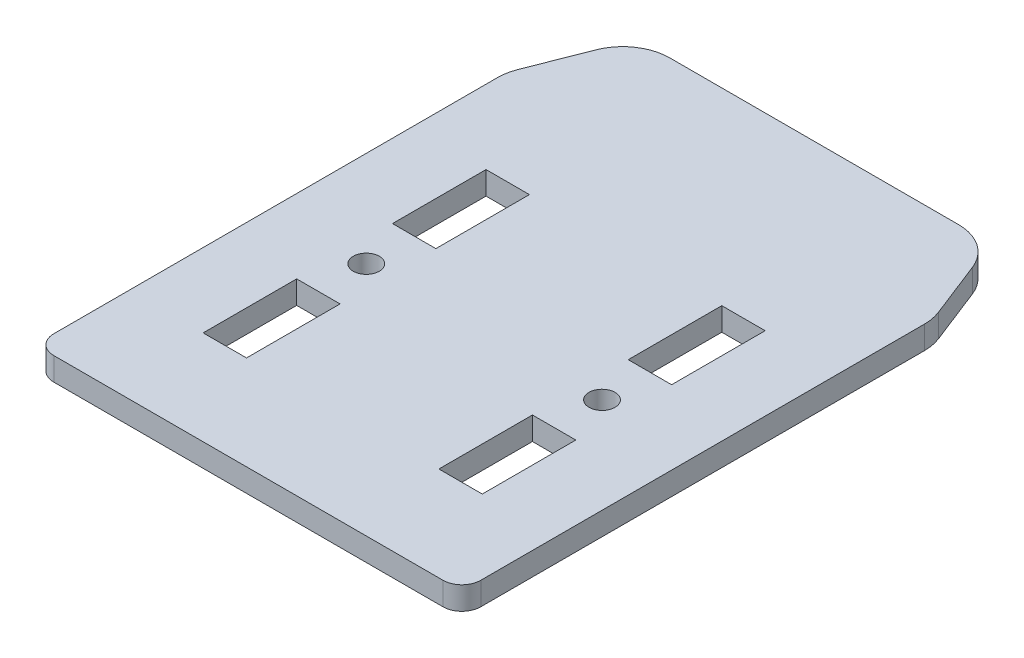
ISO-10303-21;
HEADER;
FILE_DESCRIPTION(('STEP AP214'),'2;1');
FILE_NAME('part.step','',(''),(''),'','','');
FILE_SCHEMA(('AUTOMOTIVE_DESIGN { 1 0 10303 214 1 1 1 1 }'));
ENDSEC;
DATA;
#1=APPLICATION_CONTEXT('core data for automotive mechanical design processes');
#2=APPLICATION_PROTOCOL_DEFINITION('international standard','automotive_design',2000,#1);
#3=PRODUCT_CONTEXT('',#1,'mechanical');
#4=PRODUCT('Part','Part','',(#3));
#5=PRODUCT_RELATED_PRODUCT_CATEGORY('part','',(#4));
#6=PRODUCT_DEFINITION_FORMATION('','',#4);
#7=PRODUCT_DEFINITION_CONTEXT('part definition',#1,'design');
#8=PRODUCT_DEFINITION('design','',#6,#7);
#9=PRODUCT_DEFINITION_SHAPE('','',#8);
#10=(LENGTH_UNIT() NAMED_UNIT(*) SI_UNIT(.MILLI.,.METRE.));
#11=(NAMED_UNIT(*) PLANE_ANGLE_UNIT() SI_UNIT($,.RADIAN.));
#12=(NAMED_UNIT(*) SI_UNIT($,.STERADIAN.) SOLID_ANGLE_UNIT());
#13=UNCERTAINTY_MEASURE_WITH_UNIT(LENGTH_MEASURE(1.E-05),#10,'distance_accuracy_value','');
#14=(GEOMETRIC_REPRESENTATION_CONTEXT(3) GLOBAL_UNCERTAINTY_ASSIGNED_CONTEXT((#13)) GLOBAL_UNIT_ASSIGNED_CONTEXT((#10,
#11,#12)) REPRESENTATION_CONTEXT('',''));
#15=CARTESIAN_POINT('',(0.,0.,0.));
#16=DIRECTION('',(0.,0.,1.));
#17=DIRECTION('',(1.,0.,0.));
#18=AXIS2_PLACEMENT_3D('',#15,#16,#17);
#19=CARTESIAN_POINT('',(28.7528,3.0988,0.));
#20=DIRECTION('',(1.,0.,0.));
#21=DIRECTION('',(0.,0.,-1.));
#22=AXIS2_PLACEMENT_3D('',#19,#20,#21);
#23=PLANE('',#22);
#24=DIRECTION('',(0.,0.,1.));
#25=VECTOR('',#24,1.);
#26=CARTESIAN_POINT('',(28.7528,3.0988,0.));
#27=LINE('',#26,#25);
#28=CARTESIAN_POINT('',(28.7528,3.0988,-24.1998577801837));
#29=VERTEX_POINT('',#28);
#30=CARTESIAN_POINT('',(28.7528,3.0988,35.56));
#31=VERTEX_POINT('',#30);
#32=EDGE_CURVE('E267',#29,#31,#27,.T.);
#33=ORIENTED_EDGE('',*,*,#32,.T.);
#34=DIRECTION('',(0.,1.,0.));
#35=VECTOR('',#34,1.);
#36=CARTESIAN_POINT('',(28.7528,0.,35.56));
#37=LINE('',#36,#35);
#38=CARTESIAN_POINT('',(28.7528,0.,35.56));
#39=VERTEX_POINT('',#38);
#40=EDGE_CURVE('E408',#31,#39,#37,.F.);
#41=ORIENTED_EDGE('',*,*,#40,.T.);
#42=DIRECTION('',(0.,0.,1.));
#43=VECTOR('',#42,1.);
#44=CARTESIAN_POINT('',(28.7528,0.,0.));
#45=LINE('',#44,#43);
#46=CARTESIAN_POINT('',(28.7528,0.,-24.1998577801837));
#47=VERTEX_POINT('',#46);
#48=EDGE_CURVE('E313',#47,#39,#45,.T.);
#49=ORIENTED_EDGE('',*,*,#48,.F.);
#50=DIRECTION('',(0.,1.,0.));
#51=VECTOR('',#50,1.);
#52=CARTESIAN_POINT('',(28.7528,3.0988,-24.1998577801837));
#53=LINE('',#52,#51);
#54=EDGE_CURVE('E389',#47,#29,#53,.T.);
#55=ORIENTED_EDGE('',*,*,#54,.T.);
#56=EDGE_LOOP('',(#33,#41,#49,#55));
#57=FACE_BOUND('',#56,.T.);
#58=ADVANCED_FACE('F37',(#57),#23,.T.);
#59=CARTESIAN_POINT('',(0.,3.0988,0.));
#60=DIRECTION('',(0.,1.,0.));
#61=DIRECTION('',(0.,0.,1.));
#62=AXIS2_PLACEMENT_3D('',#59,#60,#61);
#63=PLANE('',#62);
#64=DIRECTION('',(-0.364960948531727,0.,-0.931022827887062));
#65=VECTOR('',#64,1.);
#66=CARTESIAN_POINT('',(33.55361699767,3.0988,-13.1530178630866));
#67=LINE('',#66,#65);
#68=CARTESIAN_POINT('',(28.3147949570828,3.0988,-26.5173598033601));
#69=VERTEX_POINT('',#68);
#70=CARTESIAN_POINT('',(25.3551392069149,3.0988,-34.0675020231763));
#71=VERTEX_POINT('',#70);
#72=EDGE_CURVE('E424',#69,#71,#67,.T.);
#73=ORIENTED_EDGE('',*,*,#72,.T.);
#74=CARTESIAN_POINT('',(19.4431442498321,3.0988,-31.7499999999998));
#75=DIRECTION('',(0.,1.,0.));
#76=DIRECTION('',(0.,0.,1.));
#77=AXIS2_PLACEMENT_3D('',#74,#75,#76);
#78=CIRCLE('',#77,6.35);
#79=CARTESIAN_POINT('',(19.4431442498321,3.0988,-38.0999999999998));
#80=VERTEX_POINT('',#79);
#81=EDGE_CURVE('E45',#71,#80,#78,.T.);
#82=ORIENTED_EDGE('',*,*,#81,.T.);
#83=DIRECTION('',(-1.,0.,0.));
#84=VECTOR('',#83,1.);
#85=CARTESIAN_POINT('',(35.2771787575676,3.0988,-38.0999999999998));
#86=LINE('',#85,#84);
#87=CARTESIAN_POINT('',(-19.4431442498321,3.0988,-38.0999999999998));
#88=VERTEX_POINT('',#87);
#89=EDGE_CURVE('E423',#80,#88,#86,.T.);
#90=ORIENTED_EDGE('',*,*,#89,.T.);
#91=CARTESIAN_POINT('',(-19.4431442498321,3.0988,-31.7499999999998));
#92=DIRECTION('',(0.,1.,0.));
#93=DIRECTION('',(0.,0.,1.));
#94=AXIS2_PLACEMENT_3D('',#91,#92,#93);
#95=CIRCLE('',#94,6.35);
#96=CARTESIAN_POINT('',(-25.3551392069149,3.0988,-34.0675020231763));
#97=VERTEX_POINT('',#96);
#98=EDGE_CURVE('E52',#88,#97,#95,.T.);
#99=ORIENTED_EDGE('',*,*,#98,.T.);
#100=DIRECTION('',(0.364960948531727,0.,-0.931022827887062));
#101=VECTOR('',#100,1.);
#102=CARTESIAN_POINT('',(-33.55361699767,3.0988,-13.1530178630866));
#103=LINE('',#102,#101);
#104=CARTESIAN_POINT('',(-28.3147949570828,3.0988,-26.5173598033601));
#105=VERTEX_POINT('',#104);
#106=EDGE_CURVE('E451',#105,#97,#103,.T.);
#107=ORIENTED_EDGE('',*,*,#106,.F.);
#108=CARTESIAN_POINT('',(-22.4028,3.0988,-24.1998577801836));
#109=DIRECTION('',(0.,1.,0.));
#110=DIRECTION('',(0.,0.,1.));
#111=AXIS2_PLACEMENT_3D('',#108,#109,#110);
#112=CIRCLE('',#111,6.35);
#113=CARTESIAN_POINT('',(-28.7528,3.0988,-24.1998577801836));
#114=VERTEX_POINT('',#113);
#115=EDGE_CURVE('E376',#105,#114,#112,.T.);
#116=ORIENTED_EDGE('',*,*,#115,.T.);
#117=DIRECTION('',(0.,0.,1.));
#118=VECTOR('',#117,1.);
#119=CARTESIAN_POINT('',(-28.7528,3.0988,0.));
#120=LINE('',#119,#118);
#121=CARTESIAN_POINT('',(-28.7528,3.0988,35.56));
#122=VERTEX_POINT('',#121);
#123=EDGE_CURVE('E270',#114,#122,#120,.T.);
#124=ORIENTED_EDGE('',*,*,#123,.T.);
#125=CARTESIAN_POINT('',(-26.2128,3.0988,35.56));
#126=DIRECTION('',(0.,1.,0.));
#127=DIRECTION('',(0.,0.,1.));
#128=AXIS2_PLACEMENT_3D('',#125,#126,#127);
#129=CIRCLE('',#128,2.54);
#130=CARTESIAN_POINT('',(-26.2128,3.0988,38.1));
#131=VERTEX_POINT('',#130);
#132=EDGE_CURVE('E406',#122,#131,#129,.T.);
#133=ORIENTED_EDGE('',*,*,#132,.T.);
#134=DIRECTION('',(1.,0.,0.));
#135=VECTOR('',#134,1.);
#136=CARTESIAN_POINT('',(28.7528,3.0988,38.1));
#137=LINE('',#136,#135);
#138=CARTESIAN_POINT('',(26.2128,3.0988,38.1));
#139=VERTEX_POINT('',#138);
#140=EDGE_CURVE('E818',#131,#139,#137,.T.);
#141=ORIENTED_EDGE('',*,*,#140,.T.);
#142=CARTESIAN_POINT('',(26.2128,3.0988,35.56));
#143=DIRECTION('',(0.,1.,0.));
#144=DIRECTION('',(0.,0.,1.));
#145=AXIS2_PLACEMENT_3D('',#142,#143,#144);
#146=CIRCLE('',#145,2.54);
#147=EDGE_CURVE('E404',#139,#31,#146,.T.);
#148=ORIENTED_EDGE('',*,*,#147,.T.);
#149=ORIENTED_EDGE('',*,*,#32,.F.);
#150=CARTESIAN_POINT('',(22.4028,3.0988,-24.1998577801837));
#151=DIRECTION('',(0.,1.,0.));
#152=DIRECTION('',(0.,0.,1.));
#153=AXIS2_PLACEMENT_3D('',#150,#151,#152);
#154=CIRCLE('',#153,6.35);
#155=EDGE_CURVE('E352',#29,#69,#154,.T.);
#156=ORIENTED_EDGE('',*,*,#155,.T.);
#157=EDGE_LOOP('',(#73,#82,#90,#99,#107,#116,#124,#133,#141,#148,#149,#156));
#158=FACE_BOUND('',#157,.T.);
#159=CARTESIAN_POINT('',(15.875,3.0988,6.35000000000003));
#160=DIRECTION('',(0.,1.,0.));
#161=DIRECTION('',(0.,0.,1.));
#162=AXIS2_PLACEMENT_3D('',#159,#160,#161);
#163=CIRCLE('',#162,1.7526);
#164=CARTESIAN_POINT('',(15.875,3.0988,8.10260000000003));
#165=VERTEX_POINT('',#164);
#166=EDGE_CURVE('E443',#165,#165,#163,.T.);
#167=ORIENTED_EDGE('',*,*,#166,.F.);
#168=EDGE_LOOP('',(#167));
#169=FACE_BOUND('',#168,.T.);
#170=CARTESIAN_POINT('',(-15.875,3.0988,6.35000000000004));
#171=DIRECTION('',(0.,1.,0.));
#172=DIRECTION('',(0.,0.,1.));
#173=AXIS2_PLACEMENT_3D('',#170,#171,#172);
#174=CIRCLE('',#173,1.7526);
#175=CARTESIAN_POINT('',(-15.875,3.0988,8.10260000000004));
#176=VERTEX_POINT('',#175);
#177=EDGE_CURVE('E455',#176,#176,#174,.T.);
#178=ORIENTED_EDGE('',*,*,#177,.F.);
#179=EDGE_LOOP('',(#178));
#180=FACE_BOUND('',#179,.T.);
#181=DIRECTION('',(0.,0.,-1.));
#182=VECTOR('',#181,1.);
#183=CARTESIAN_POINT('',(-12.954,3.0988,0.));
#184=LINE('',#183,#182);
#185=CARTESIAN_POINT('',(-12.954,3.0988,-0.0999999999999708));
#186=VERTEX_POINT('',#185);
#187=CARTESIAN_POINT('',(-12.954,3.0988,-12.7));
#188=VERTEX_POINT('',#187);
#189=EDGE_CURVE('E229',#186,#188,#184,.T.);
#190=ORIENTED_EDGE('',*,*,#189,.F.);
#191=DIRECTION('',(1.,0.,0.));
#192=VECTOR('',#191,1.);
#193=CARTESIAN_POINT('',(0.,3.0988,-0.0999999999999852));
#194=LINE('',#193,#192);
#195=CARTESIAN_POINT('',(-18.796,3.0988,-0.0999999999999643));
#196=VERTEX_POINT('',#195);
#197=EDGE_CURVE('E245',#196,#186,#194,.T.);
#198=ORIENTED_EDGE('',*,*,#197,.F.);
#199=DIRECTION('',(0.,0.,1.));
#200=VECTOR('',#199,1.);
#201=CARTESIAN_POINT('',(-18.796,3.0988,0.));
#202=LINE('',#201,#200);
#203=CARTESIAN_POINT('',(-18.796,3.0988,-12.7));
#204=VERTEX_POINT('',#203);
#205=EDGE_CURVE('E252',#204,#196,#202,.T.);
#206=ORIENTED_EDGE('',*,*,#205,.F.);
#207=DIRECTION('',(-1.,0.,0.));
#208=VECTOR('',#207,1.);
#209=CARTESIAN_POINT('',(0.,3.0988,-12.7));
#210=LINE('',#209,#208);
#211=EDGE_CURVE('E248',#188,#204,#210,.T.);
#212=ORIENTED_EDGE('',*,*,#211,.F.);
#213=EDGE_LOOP('',(#190,#198,#206,#212));
#214=FACE_BOUND('',#213,.T.);
#215=DIRECTION('',(-1.,0.,0.));
#216=VECTOR('',#215,1.);
#217=CARTESIAN_POINT('',(0.,3.0988,-0.0999999999999852));
#218=LINE('',#217,#216);
#219=CARTESIAN_POINT('',(18.796,3.0988,-0.0999999999999643));
#220=VERTEX_POINT('',#219);
#221=CARTESIAN_POINT('',(12.954,3.0988,-0.0999999999999708));
#222=VERTEX_POINT('',#221);
#223=EDGE_CURVE('E258',#220,#222,#218,.T.);
#224=ORIENTED_EDGE('',*,*,#223,.T.);
#225=DIRECTION('',(0.,0.,-1.));
#226=VECTOR('',#225,1.);
#227=CARTESIAN_POINT('',(12.954,3.0988,0.));
#228=LINE('',#227,#226);
#229=CARTESIAN_POINT('',(12.954,3.0988,-12.7));
#230=VERTEX_POINT('',#229);
#231=EDGE_CURVE('E261',#222,#230,#228,.T.);
#232=ORIENTED_EDGE('',*,*,#231,.T.);
#233=DIRECTION('',(1.,0.,0.));
#234=VECTOR('',#233,1.);
#235=CARTESIAN_POINT('',(0.,3.0988,-12.7));
#236=LINE('',#235,#234);
#237=CARTESIAN_POINT('',(18.796,3.0988,-12.7));
#238=VERTEX_POINT('',#237);
#239=EDGE_CURVE('E263',#230,#238,#236,.T.);
#240=ORIENTED_EDGE('',*,*,#239,.T.);
#241=DIRECTION('',(0.,0.,1.));
#242=VECTOR('',#241,1.);
#243=CARTESIAN_POINT('',(18.796,3.0988,0.));
#244=LINE('',#243,#242);
#245=EDGE_CURVE('E265',#238,#220,#244,.T.);
#246=ORIENTED_EDGE('',*,*,#245,.T.);
#247=EDGE_LOOP('',(#224,#232,#240,#246));
#248=FACE_BOUND('',#247,.T.);
#249=DIRECTION('',(1.,0.,0.));
#250=VECTOR('',#249,1.);
#251=CARTESIAN_POINT('',(0.,3.0988,25.4));
#252=LINE('',#251,#250);
#253=CARTESIAN_POINT('',(12.954,3.0988,25.4));
#254=VERTEX_POINT('',#253);
#255=CARTESIAN_POINT('',(18.796,3.0988,25.4));
#256=VERTEX_POINT('',#255);
#257=EDGE_CURVE('E273',#254,#256,#252,.T.);
#258=ORIENTED_EDGE('',*,*,#257,.F.);
#259=DIRECTION('',(0.,0.,-1.));
#260=VECTOR('',#259,1.);
#261=CARTESIAN_POINT('',(12.954,3.0988,0.));
#262=LINE('',#261,#260);
#263=CARTESIAN_POINT('',(12.954,3.0988,12.8));
#264=VERTEX_POINT('',#263);
#265=EDGE_CURVE('E276',#254,#264,#262,.T.);
#266=ORIENTED_EDGE('',*,*,#265,.T.);
#267=DIRECTION('',(-1.,0.,0.));
#268=VECTOR('',#267,1.);
#269=CARTESIAN_POINT('',(0.,3.0988,12.8));
#270=LINE('',#269,#268);
#271=CARTESIAN_POINT('',(18.796,3.0988,12.8));
#272=VERTEX_POINT('',#271);
#273=EDGE_CURVE('E278',#272,#264,#270,.T.);
#274=ORIENTED_EDGE('',*,*,#273,.F.);
#275=DIRECTION('',(0.,0.,1.));
#276=VECTOR('',#275,1.);
#277=CARTESIAN_POINT('',(18.796,3.0988,0.));
#278=LINE('',#277,#276);
#279=EDGE_CURVE('E281',#272,#256,#278,.T.);
#280=ORIENTED_EDGE('',*,*,#279,.T.);
#281=EDGE_LOOP('',(#258,#266,#274,#280));
#282=FACE_BOUND('',#281,.T.);
#283=DIRECTION('',(1.,0.,0.));
#284=VECTOR('',#283,1.);
#285=CARTESIAN_POINT('',(0.,3.0988,12.8));
#286=LINE('',#285,#284);
#287=CARTESIAN_POINT('',(-18.796,3.0988,12.8));
#288=VERTEX_POINT('',#287);
#289=CARTESIAN_POINT('',(-12.954,3.0988,12.8));
#290=VERTEX_POINT('',#289);
#291=EDGE_CURVE('E283',#288,#290,#286,.T.);
#292=ORIENTED_EDGE('',*,*,#291,.T.);
#293=DIRECTION('',(0.,0.,1.));
#294=VECTOR('',#293,1.);
#295=CARTESIAN_POINT('',(-12.954,3.0988,0.));
#296=LINE('',#295,#294);
#297=CARTESIAN_POINT('',(-12.954,3.0988,25.4));
#298=VERTEX_POINT('',#297);
#299=EDGE_CURVE('E286',#290,#298,#296,.T.);
#300=ORIENTED_EDGE('',*,*,#299,.T.);
#301=DIRECTION('',(-1.,0.,0.));
#302=VECTOR('',#301,1.);
#303=CARTESIAN_POINT('',(0.,3.0988,25.4));
#304=LINE('',#303,#302);
#305=CARTESIAN_POINT('',(-18.796,3.0988,25.4));
#306=VERTEX_POINT('',#305);
#307=EDGE_CURVE('E288',#298,#306,#304,.T.);
#308=ORIENTED_EDGE('',*,*,#307,.T.);
#309=DIRECTION('',(0.,0.,1.));
#310=VECTOR('',#309,1.);
#311=CARTESIAN_POINT('',(-18.796,3.0988,0.));
#312=LINE('',#311,#310);
#313=EDGE_CURVE('E290',#288,#306,#312,.T.);
#314=ORIENTED_EDGE('',*,*,#313,.F.);
#315=EDGE_LOOP('',(#292,#300,#308,#314));
#316=FACE_BOUND('',#315,.T.);
#317=ADVANCED_FACE('F242',(#158,#169,#180,#214,#248,#282,#316),#63,.T.);
#318=CARTESIAN_POINT('',(0.,0.,0.));
#319=DIRECTION('',(0.,1.,0.));
#320=DIRECTION('',(0.,0.,1.));
#321=AXIS2_PLACEMENT_3D('',#318,#319,#320);
#322=PLANE('',#321);
#323=CARTESIAN_POINT('',(15.875,0.,6.35000000000003));
#324=DIRECTION('',(0.,1.,0.));
#325=DIRECTION('',(0.,0.,1.));
#326=AXIS2_PLACEMENT_3D('',#323,#324,#325);
#327=CIRCLE('',#326,1.7526);
#328=CARTESIAN_POINT('',(15.875,0.,8.10260000000003));
#329=VERTEX_POINT('',#328);
#330=EDGE_CURVE('E446',#329,#329,#327,.T.);
#331=ORIENTED_EDGE('',*,*,#330,.T.);
#332=EDGE_LOOP('',(#331));
#333=FACE_BOUND('',#332,.T.);
#334=CARTESIAN_POINT('',(-15.875,0.,6.35000000000004));
#335=DIRECTION('',(0.,1.,0.));
#336=DIRECTION('',(0.,0.,1.));
#337=AXIS2_PLACEMENT_3D('',#334,#335,#336);
#338=CIRCLE('',#337,1.7526);
#339=CARTESIAN_POINT('',(-15.875,0.,8.10260000000004));
#340=VERTEX_POINT('',#339);
#341=EDGE_CURVE('E296',#340,#340,#338,.T.);
#342=ORIENTED_EDGE('',*,*,#341,.T.);
#343=EDGE_LOOP('',(#342));
#344=FACE_BOUND('',#343,.T.);
#345=DIRECTION('',(0.,0.,-1.));
#346=VECTOR('',#345,1.);
#347=CARTESIAN_POINT('',(-12.954,0.,0.));
#348=LINE('',#347,#346);
#349=CARTESIAN_POINT('',(-12.954,0.,-0.0999999999999708));
#350=VERTEX_POINT('',#349);
#351=CARTESIAN_POINT('',(-12.954,0.,-12.7));
#352=VERTEX_POINT('',#351);
#353=EDGE_CURVE('E232',#350,#352,#348,.T.);
#354=ORIENTED_EDGE('',*,*,#353,.T.);
#355=DIRECTION('',(-1.,0.,0.));
#356=VECTOR('',#355,1.);
#357=CARTESIAN_POINT('',(0.,0.,-12.7));
#358=LINE('',#357,#356);
#359=CARTESIAN_POINT('',(-18.796,0.,-12.7));
#360=VERTEX_POINT('',#359);
#361=EDGE_CURVE('E301',#352,#360,#358,.T.);
#362=ORIENTED_EDGE('',*,*,#361,.T.);
#363=DIRECTION('',(0.,0.,1.));
#364=VECTOR('',#363,1.);
#365=CARTESIAN_POINT('',(-18.796,0.,0.));
#366=LINE('',#365,#364);
#367=CARTESIAN_POINT('',(-18.796,0.,-0.0999999999999643));
#368=VERTEX_POINT('',#367);
#369=EDGE_CURVE('E298',#360,#368,#366,.T.);
#370=ORIENTED_EDGE('',*,*,#369,.T.);
#371=DIRECTION('',(1.,0.,0.));
#372=VECTOR('',#371,1.);
#373=CARTESIAN_POINT('',(0.,0.,-0.0999999999999852));
#374=LINE('',#373,#372);
#375=EDGE_CURVE('E295',#368,#350,#374,.T.);
#376=ORIENTED_EDGE('',*,*,#375,.T.);
#377=EDGE_LOOP('',(#354,#362,#370,#376));
#378=FACE_BOUND('',#377,.T.);
#379=DIRECTION('',(-1.,0.,0.));
#380=VECTOR('',#379,1.);
#381=CARTESIAN_POINT('',(0.,0.,-0.0999999999999852));
#382=LINE('',#381,#380);
#383=CARTESIAN_POINT('',(18.796,0.,-0.0999999999999643));
#384=VERTEX_POINT('',#383);
#385=CARTESIAN_POINT('',(12.954,0.,-0.0999999999999708));
#386=VERTEX_POINT('',#385);
#387=EDGE_CURVE('E304',#384,#386,#382,.T.);
#388=ORIENTED_EDGE('',*,*,#387,.F.);
#389=DIRECTION('',(0.,0.,1.));
#390=VECTOR('',#389,1.);
#391=CARTESIAN_POINT('',(18.796,0.,0.));
#392=LINE('',#391,#390);
#393=CARTESIAN_POINT('',(18.796,0.,-12.7));
#394=VERTEX_POINT('',#393);
#395=EDGE_CURVE('E311',#394,#384,#392,.T.);
#396=ORIENTED_EDGE('',*,*,#395,.F.);
#397=DIRECTION('',(1.,0.,0.));
#398=VECTOR('',#397,1.);
#399=CARTESIAN_POINT('',(0.,0.,-12.7));
#400=LINE('',#399,#398);
#401=CARTESIAN_POINT('',(12.954,0.,-12.7));
#402=VERTEX_POINT('',#401);
#403=EDGE_CURVE('E309',#402,#394,#400,.T.);
#404=ORIENTED_EDGE('',*,*,#403,.F.);
#405=DIRECTION('',(0.,0.,-1.));
#406=VECTOR('',#405,1.);
#407=CARTESIAN_POINT('',(12.954,0.,0.));
#408=LINE('',#407,#406);
#409=EDGE_CURVE('E307',#386,#402,#408,.T.);
#410=ORIENTED_EDGE('',*,*,#409,.F.);
#411=EDGE_LOOP('',(#388,#396,#404,#410));
#412=FACE_BOUND('',#411,.T.);
#413=DIRECTION('',(1.,0.,0.));
#414=VECTOR('',#413,1.);
#415=CARTESIAN_POINT('',(0.,0.,25.4));
#416=LINE('',#415,#414);
#417=CARTESIAN_POINT('',(12.954,0.,25.4));
#418=VERTEX_POINT('',#417);
#419=CARTESIAN_POINT('',(18.796,0.,25.4));
#420=VERTEX_POINT('',#419);
#421=EDGE_CURVE('E319',#418,#420,#416,.T.);
#422=ORIENTED_EDGE('',*,*,#421,.T.);
#423=DIRECTION('',(0.,0.,1.));
#424=VECTOR('',#423,1.);
#425=CARTESIAN_POINT('',(18.796,0.,0.));
#426=LINE('',#425,#424);
#427=CARTESIAN_POINT('',(18.796,0.,12.8));
#428=VERTEX_POINT('',#427);
#429=EDGE_CURVE('E328',#428,#420,#426,.T.);
#430=ORIENTED_EDGE('',*,*,#429,.F.);
#431=DIRECTION('',(-1.,0.,0.));
#432=VECTOR('',#431,1.);
#433=CARTESIAN_POINT('',(0.,0.,12.8));
#434=LINE('',#433,#432);
#435=CARTESIAN_POINT('',(12.954,0.,12.8));
#436=VERTEX_POINT('',#435);
#437=EDGE_CURVE('E325',#428,#436,#434,.T.);
#438=ORIENTED_EDGE('',*,*,#437,.T.);
#439=DIRECTION('',(0.,0.,-1.));
#440=VECTOR('',#439,1.);
#441=CARTESIAN_POINT('',(12.954,0.,0.));
#442=LINE('',#441,#440);
#443=EDGE_CURVE('E322',#418,#436,#442,.T.);
#444=ORIENTED_EDGE('',*,*,#443,.F.);
#445=EDGE_LOOP('',(#422,#430,#438,#444));
#446=FACE_BOUND('',#445,.T.);
#447=DIRECTION('',(1.,0.,0.));
#448=VECTOR('',#447,1.);
#449=CARTESIAN_POINT('',(0.,0.,12.8));
#450=LINE('',#449,#448);
#451=CARTESIAN_POINT('',(-18.796,0.,12.8));
#452=VERTEX_POINT('',#451);
#453=CARTESIAN_POINT('',(-12.954,0.,12.8));
#454=VERTEX_POINT('',#453);
#455=EDGE_CURVE('E331',#452,#454,#450,.T.);
#456=ORIENTED_EDGE('',*,*,#455,.F.);
#457=DIRECTION('',(0.,0.,1.));
#458=VECTOR('',#457,1.);
#459=CARTESIAN_POINT('',(-18.796,0.,0.));
#460=LINE('',#459,#458);
#461=CARTESIAN_POINT('',(-18.796,0.,25.4));
#462=VERTEX_POINT('',#461);
#463=EDGE_CURVE('E249',#452,#462,#460,.T.);
#464=ORIENTED_EDGE('',*,*,#463,.T.);
#465=DIRECTION('',(-1.,0.,0.));
#466=VECTOR('',#465,1.);
#467=CARTESIAN_POINT('',(0.,0.,25.4));
#468=LINE('',#467,#466);
#469=CARTESIAN_POINT('',(-12.954,0.,25.4));
#470=VERTEX_POINT('',#469);
#471=EDGE_CURVE('E336',#470,#462,#468,.T.);
#472=ORIENTED_EDGE('',*,*,#471,.F.);
#473=DIRECTION('',(0.,0.,1.));
#474=VECTOR('',#473,1.);
#475=CARTESIAN_POINT('',(-12.954,0.,0.));
#476=LINE('',#475,#474);
#477=EDGE_CURVE('E334',#454,#470,#476,.T.);
#478=ORIENTED_EDGE('',*,*,#477,.F.);
#479=EDGE_LOOP('',(#456,#464,#472,#478));
#480=FACE_BOUND('',#479,.T.);
#481=DIRECTION('',(-1.,0.,0.));
#482=VECTOR('',#481,1.);
#483=CARTESIAN_POINT('',(35.2771787575676,0.,-38.0999999999998));
#484=LINE('',#483,#482);
#485=CARTESIAN_POINT('',(19.4431442498321,0.,-38.0999999999998));
#486=VERTEX_POINT('',#485);
#487=CARTESIAN_POINT('',(-19.4431442498321,0.,-38.0999999999998));
#488=VERTEX_POINT('',#487);
#489=EDGE_CURVE('E433',#486,#488,#484,.T.);
#490=ORIENTED_EDGE('',*,*,#489,.F.);
#491=CARTESIAN_POINT('',(19.4431442498321,0.,-31.7499999999998));
#492=DIRECTION('',(0.,1.,0.));
#493=DIRECTION('',(0.,0.,1.));
#494=AXIS2_PLACEMENT_3D('',#491,#492,#493);
#495=CIRCLE('',#494,6.35);
#496=CARTESIAN_POINT('',(25.3551392069149,0.,-34.0675020231763));
#497=VERTEX_POINT('',#496);
#498=EDGE_CURVE('E417',#486,#497,#495,.F.);
#499=ORIENTED_EDGE('',*,*,#498,.T.);
#500=DIRECTION('',(-0.364960948531727,0.,-0.931022827887062));
#501=VECTOR('',#500,1.);
#502=CARTESIAN_POINT('',(33.55361699767,0.,-13.1530178630866));
#503=LINE('',#502,#501);
#504=CARTESIAN_POINT('',(28.3147949570828,0.,-26.5173598033601));
#505=VERTEX_POINT('',#504);
#506=EDGE_CURVE('E439',#505,#497,#503,.T.);
#507=ORIENTED_EDGE('',*,*,#506,.F.);
#508=CARTESIAN_POINT('',(22.4028,0.,-24.1998577801837));
#509=DIRECTION('',(0.,1.,0.));
#510=DIRECTION('',(0.,0.,1.));
#511=AXIS2_PLACEMENT_3D('',#508,#509,#510);
#512=CIRCLE('',#511,6.35);
#513=EDGE_CURVE('E378',#505,#47,#512,.F.);
#514=ORIENTED_EDGE('',*,*,#513,.T.);
#515=ORIENTED_EDGE('',*,*,#48,.T.);
#516=CARTESIAN_POINT('',(26.2128,0.,35.56));
#517=DIRECTION('',(0.,1.,0.));
#518=DIRECTION('',(0.,0.,1.));
#519=AXIS2_PLACEMENT_3D('',#516,#517,#518);
#520=CIRCLE('',#519,2.54);
#521=CARTESIAN_POINT('',(26.2128,0.,38.1));
#522=VERTEX_POINT('',#521);
#523=EDGE_CURVE('E398',#39,#522,#520,.F.);
#524=ORIENTED_EDGE('',*,*,#523,.T.);
#525=DIRECTION('',(1.,0.,0.));
#526=VECTOR('',#525,1.);
#527=CARTESIAN_POINT('',(28.7528,0.,38.1));
#528=LINE('',#527,#526);
#529=CARTESIAN_POINT('',(-26.2128,0.,38.1));
#530=VERTEX_POINT('',#529);
#531=EDGE_CURVE('E432',#530,#522,#528,.T.);
#532=ORIENTED_EDGE('',*,*,#531,.F.);
#533=CARTESIAN_POINT('',(-26.2128,0.,35.56));
#534=DIRECTION('',(0.,1.,0.));
#535=DIRECTION('',(0.,0.,1.));
#536=AXIS2_PLACEMENT_3D('',#533,#534,#535);
#537=CIRCLE('',#536,2.54);
#538=CARTESIAN_POINT('',(-28.7528,0.,35.56));
#539=VERTEX_POINT('',#538);
#540=EDGE_CURVE('E400',#530,#539,#537,.F.);
#541=ORIENTED_EDGE('',*,*,#540,.T.);
#542=DIRECTION('',(0.,0.,1.));
#543=VECTOR('',#542,1.);
#544=CARTESIAN_POINT('',(-28.7528,0.,0.));
#545=LINE('',#544,#543);
#546=CARTESIAN_POINT('',(-28.7528,0.,-24.1998577801836));
#547=VERTEX_POINT('',#546);
#548=EDGE_CURVE('E316',#547,#539,#545,.T.);
#549=ORIENTED_EDGE('',*,*,#548,.F.);
#550=CARTESIAN_POINT('',(-22.4028,0.,-24.1998577801836));
#551=DIRECTION('',(0.,1.,0.));
#552=DIRECTION('',(0.,0.,1.));
#553=AXIS2_PLACEMENT_3D('',#550,#551,#552);
#554=CIRCLE('',#553,6.35);
#555=CARTESIAN_POINT('',(-28.3147949570828,0.,-26.5173598033601));
#556=VERTEX_POINT('',#555);
#557=EDGE_CURVE('E380',#547,#556,#554,.F.);
#558=ORIENTED_EDGE('',*,*,#557,.T.);
#559=DIRECTION('',(0.364960948531727,0.,-0.931022827887062));
#560=VECTOR('',#559,1.);
#561=CARTESIAN_POINT('',(-33.55361699767,0.,-13.1530178630866));
#562=LINE('',#561,#560);
#563=CARTESIAN_POINT('',(-25.3551392069149,0.,-34.0675020231763));
#564=VERTEX_POINT('',#563);
#565=EDGE_CURVE('E448',#556,#564,#562,.T.);
#566=ORIENTED_EDGE('',*,*,#565,.T.);
#567=CARTESIAN_POINT('',(-19.4431442498321,0.,-31.7499999999998));
#568=DIRECTION('',(0.,1.,0.));
#569=DIRECTION('',(0.,0.,1.));
#570=AXIS2_PLACEMENT_3D('',#567,#568,#569);
#571=CIRCLE('',#570,6.35);
#572=EDGE_CURVE('E415',#564,#488,#571,.F.);
#573=ORIENTED_EDGE('',*,*,#572,.T.);
#574=EDGE_LOOP('',(#490,#499,#507,#514,#515,#524,#532,#541,#549,#558,#566,#573));
#575=FACE_BOUND('',#574,.T.);
#576=ADVANCED_FACE('F438',(#333,#344,#378,#412,#446,#480,#575),#322,.F.);
#577=CARTESIAN_POINT('',(0.,3.0988,12.8));
#578=DIRECTION('',(0.,0.,-1.));
#579=DIRECTION('',(-1.,0.,0.));
#580=AXIS2_PLACEMENT_3D('',#577,#578,#579);
#581=PLANE('',#580);
#582=ORIENTED_EDGE('',*,*,#455,.T.);
#583=DIRECTION('',(0.,-1.,0.));
#584=VECTOR('',#583,1.);
#585=CARTESIAN_POINT('',(-12.954,3.0988,12.8));
#586=LINE('',#585,#584);
#587=EDGE_CURVE('E349',#290,#454,#586,.T.);
#588=ORIENTED_EDGE('',*,*,#587,.F.);
#589=ORIENTED_EDGE('',*,*,#291,.F.);
#590=DIRECTION('',(0.,-1.,0.));
#591=VECTOR('',#590,1.);
#592=CARTESIAN_POINT('',(-18.796,3.0988,12.8));
#593=LINE('',#592,#591);
#594=EDGE_CURVE('E341',#288,#452,#593,.T.);
#595=ORIENTED_EDGE('',*,*,#594,.T.);
#596=EDGE_LOOP('',(#582,#588,#589,#595));
#597=FACE_BOUND('',#596,.T.);
#598=ADVANCED_FACE('F468',(#597),#581,.F.);
#599=CARTESIAN_POINT('',(-12.954,3.0988,0.));
#600=DIRECTION('',(1.,0.,0.));
#601=DIRECTION('',(0.,0.,-1.));
#602=AXIS2_PLACEMENT_3D('',#599,#600,#601);
#603=PLANE('',#602);
#604=ORIENTED_EDGE('',*,*,#477,.T.);
#605=DIRECTION('',(0.,-1.,0.));
#606=VECTOR('',#605,1.);
#607=CARTESIAN_POINT('',(-12.954,3.0988,25.4));
#608=LINE('',#607,#606);
#609=EDGE_CURVE('E346',#298,#470,#608,.T.);
#610=ORIENTED_EDGE('',*,*,#609,.F.);
#611=ORIENTED_EDGE('',*,*,#299,.F.);
#612=ORIENTED_EDGE('',*,*,#587,.T.);
#613=EDGE_LOOP('',(#604,#610,#611,#612));
#614=FACE_BOUND('',#613,.T.);
#615=ADVANCED_FACE('F486',(#614),#603,.F.);
#616=CARTESIAN_POINT('',(0.,3.0988,25.4));
#617=DIRECTION('',(0.,0.,1.));
#618=DIRECTION('',(1.,0.,0.));
#619=AXIS2_PLACEMENT_3D('',#616,#617,#618);
#620=PLANE('',#619);
#621=ORIENTED_EDGE('',*,*,#471,.T.);
#622=DIRECTION('',(0.,-1.,0.));
#623=VECTOR('',#622,1.);
#624=CARTESIAN_POINT('',(-18.796,3.0988,25.4));
#625=LINE('',#624,#623);
#626=EDGE_CURVE('E343',#306,#462,#625,.T.);
#627=ORIENTED_EDGE('',*,*,#626,.F.);
#628=ORIENTED_EDGE('',*,*,#307,.F.);
#629=ORIENTED_EDGE('',*,*,#609,.T.);
#630=EDGE_LOOP('',(#621,#627,#628,#629));
#631=FACE_BOUND('',#630,.T.);
#632=ADVANCED_FACE('F482',(#631),#620,.F.);
#633=CARTESIAN_POINT('',(0.,3.0988,25.4));
#634=DIRECTION('',(0.,0.,-1.));
#635=DIRECTION('',(-1.,0.,0.));
#636=AXIS2_PLACEMENT_3D('',#633,#634,#635);
#637=PLANE('',#636);
#638=ORIENTED_EDGE('',*,*,#421,.F.);
#639=DIRECTION('',(0.,-1.,0.));
#640=VECTOR('',#639,1.);
#641=CARTESIAN_POINT('',(12.954,3.0988,25.4));
#642=LINE('',#641,#640);
#643=EDGE_CURVE('E344',#254,#418,#642,.T.);
#644=ORIENTED_EDGE('',*,*,#643,.F.);
#645=ORIENTED_EDGE('',*,*,#257,.T.);
#646=DIRECTION('',(0.,-1.,0.));
#647=VECTOR('',#646,1.);
#648=CARTESIAN_POINT('',(18.796,3.0988,25.4));
#649=LINE('',#648,#647);
#650=EDGE_CURVE('E353',#256,#420,#649,.T.);
#651=ORIENTED_EDGE('',*,*,#650,.T.);
#652=EDGE_LOOP('',(#638,#644,#645,#651));
#653=FACE_BOUND('',#652,.T.);
#654=ADVANCED_FACE('F485',(#653),#637,.T.);
#655=CARTESIAN_POINT('',(12.954,3.0988,0.));
#656=DIRECTION('',(-1.,0.,0.));
#657=DIRECTION('',(0.,0.,1.));
#658=AXIS2_PLACEMENT_3D('',#655,#656,#657);
#659=PLANE('',#658);
#660=ORIENTED_EDGE('',*,*,#443,.T.);
#661=DIRECTION('',(0.,-1.,0.));
#662=VECTOR('',#661,1.);
#663=CARTESIAN_POINT('',(12.954,3.0988,12.8));
#664=LINE('',#663,#662);
#665=EDGE_CURVE('E358',#264,#436,#664,.T.);
#666=ORIENTED_EDGE('',*,*,#665,.F.);
#667=ORIENTED_EDGE('',*,*,#265,.F.);
#668=ORIENTED_EDGE('',*,*,#643,.T.);
#669=EDGE_LOOP('',(#660,#666,#667,#668));
#670=FACE_BOUND('',#669,.T.);
#671=ADVANCED_FACE('F504',(#670),#659,.F.);
#672=CARTESIAN_POINT('',(0.,3.0988,12.8));
#673=DIRECTION('',(0.,0.,1.));
#674=DIRECTION('',(1.,0.,0.));
#675=AXIS2_PLACEMENT_3D('',#672,#673,#674);
#676=PLANE('',#675);
#677=ORIENTED_EDGE('',*,*,#437,.F.);
#678=DIRECTION('',(0.,-1.,0.));
#679=VECTOR('',#678,1.);
#680=CARTESIAN_POINT('',(18.796,3.0988,12.8));
#681=LINE('',#680,#679);
#682=EDGE_CURVE('E355',#272,#428,#681,.T.);
#683=ORIENTED_EDGE('',*,*,#682,.F.);
#684=ORIENTED_EDGE('',*,*,#273,.T.);
#685=ORIENTED_EDGE('',*,*,#665,.T.);
#686=EDGE_LOOP('',(#677,#683,#684,#685));
#687=FACE_BOUND('',#686,.T.);
#688=ADVANCED_FACE('F500',(#687),#676,.T.);
#689=CARTESIAN_POINT('',(0.,3.0988,-0.0999999999999852));
#690=DIRECTION('',(0.,0.,1.));
#691=DIRECTION('',(1.,0.,0.));
#692=AXIS2_PLACEMENT_3D('',#689,#690,#691);
#693=PLANE('',#692);
#694=ORIENTED_EDGE('',*,*,#387,.T.);
#695=DIRECTION('',(0.,-1.,0.));
#696=VECTOR('',#695,1.);
#697=CARTESIAN_POINT('',(12.954,3.0988,-0.0999999999999708));
#698=LINE('',#697,#696);
#699=EDGE_CURVE('E356',#222,#386,#698,.T.);
#700=ORIENTED_EDGE('',*,*,#699,.F.);
#701=ORIENTED_EDGE('',*,*,#223,.F.);
#702=DIRECTION('',(0.,-1.,0.));
#703=VECTOR('',#702,1.);
#704=CARTESIAN_POINT('',(18.796,3.0988,-0.0999999999999643));
#705=LINE('',#704,#703);
#706=EDGE_CURVE('E237',#220,#384,#705,.T.);
#707=ORIENTED_EDGE('',*,*,#706,.T.);
#708=EDGE_LOOP('',(#694,#700,#701,#707));
#709=FACE_BOUND('',#708,.T.);
#710=ADVANCED_FACE('F503',(#709),#693,.F.);
#711=CARTESIAN_POINT('',(12.954,3.0988,0.));
#712=DIRECTION('',(-1.,0.,0.));
#713=DIRECTION('',(0.,0.,1.));
#714=AXIS2_PLACEMENT_3D('',#711,#712,#713);
#715=PLANE('',#714);
#716=ORIENTED_EDGE('',*,*,#409,.T.);
#717=DIRECTION('',(0.,-1.,0.));
#718=VECTOR('',#717,1.);
#719=CARTESIAN_POINT('',(12.954,3.0988,-12.7));
#720=LINE('',#719,#718);
#721=EDGE_CURVE('E366',#230,#402,#720,.T.);
#722=ORIENTED_EDGE('',*,*,#721,.F.);
#723=ORIENTED_EDGE('',*,*,#231,.F.);
#724=ORIENTED_EDGE('',*,*,#699,.T.);
#725=EDGE_LOOP('',(#716,#722,#723,#724));
#726=FACE_BOUND('',#725,.T.);
#727=ADVANCED_FACE('F522',(#726),#715,.F.);
#728=CARTESIAN_POINT('',(0.,3.0988,-12.7));
#729=DIRECTION('',(0.,0.,-1.));
#730=DIRECTION('',(-1.,0.,0.));
#731=AXIS2_PLACEMENT_3D('',#728,#729,#730);
#732=PLANE('',#731);
#733=ORIENTED_EDGE('',*,*,#403,.T.);
#734=DIRECTION('',(0.,-1.,0.));
#735=VECTOR('',#734,1.);
#736=CARTESIAN_POINT('',(18.796,3.0988,-12.7));
#737=LINE('',#736,#735);
#738=EDGE_CURVE('E363',#238,#394,#737,.T.);
#739=ORIENTED_EDGE('',*,*,#738,.F.);
#740=ORIENTED_EDGE('',*,*,#239,.F.);
#741=ORIENTED_EDGE('',*,*,#721,.T.);
#742=EDGE_LOOP('',(#733,#739,#740,#741));
#743=FACE_BOUND('',#742,.T.);
#744=ADVANCED_FACE('F519',(#743),#732,.F.);
#745=CARTESIAN_POINT('',(-12.954,3.0988,0.));
#746=DIRECTION('',(-1.,0.,0.));
#747=DIRECTION('',(0.,0.,1.));
#748=AXIS2_PLACEMENT_3D('',#745,#746,#747);
#749=PLANE('',#748);
#750=ORIENTED_EDGE('',*,*,#353,.F.);
#751=DIRECTION('',(0.,-1.,0.));
#752=VECTOR('',#751,1.);
#753=CARTESIAN_POINT('',(-12.954,3.0988,-0.0999999999999708));
#754=LINE('',#753,#752);
#755=EDGE_CURVE('E226',#186,#350,#754,.T.);
#756=ORIENTED_EDGE('',*,*,#755,.F.);
#757=ORIENTED_EDGE('',*,*,#189,.T.);
#758=DIRECTION('',(0.,-1.,0.));
#759=VECTOR('',#758,1.);
#760=CARTESIAN_POINT('',(-12.954,3.0988,-12.7));
#761=LINE('',#760,#759);
#762=EDGE_CURVE('E293',#188,#352,#761,.T.);
#763=ORIENTED_EDGE('',*,*,#762,.T.);
#764=EDGE_LOOP('',(#750,#756,#757,#763));
#765=FACE_BOUND('',#764,.T.);
#766=ADVANCED_FACE('F228',(#765),#749,.T.);
#767=CARTESIAN_POINT('',(0.,3.0988,-0.0999999999999852));
#768=DIRECTION('',(0.,0.,-1.));
#769=DIRECTION('',(-1.,0.,0.));
#770=AXIS2_PLACEMENT_3D('',#767,#768,#769);
#771=PLANE('',#770);
#772=ORIENTED_EDGE('',*,*,#375,.F.);
#773=DIRECTION('',(0.,-1.,0.));
#774=VECTOR('',#773,1.);
#775=CARTESIAN_POINT('',(-18.796,3.0988,-0.0999999999999643));
#776=LINE('',#775,#774);
#777=EDGE_CURVE('E238',#196,#368,#776,.T.);
#778=ORIENTED_EDGE('',*,*,#777,.F.);
#779=ORIENTED_EDGE('',*,*,#197,.T.);
#780=ORIENTED_EDGE('',*,*,#755,.T.);
#781=EDGE_LOOP('',(#772,#778,#779,#780));
#782=FACE_BOUND('',#781,.T.);
#783=ADVANCED_FACE('F251',(#782),#771,.T.);
#784=CARTESIAN_POINT('',(-18.796,3.0988,0.));
#785=DIRECTION('',(1.,0.,0.));
#786=DIRECTION('',(0.,0.,-1.));
#787=AXIS2_PLACEMENT_3D('',#784,#785,#786);
#788=PLANE('',#787);
#789=ORIENTED_EDGE('',*,*,#369,.F.);
#790=DIRECTION('',(0.,-1.,0.));
#791=VECTOR('',#790,1.);
#792=CARTESIAN_POINT('',(-18.796,3.0988,-12.7));
#793=LINE('',#792,#791);
#794=EDGE_CURVE('E372',#204,#360,#793,.T.);
#795=ORIENTED_EDGE('',*,*,#794,.F.);
#796=ORIENTED_EDGE('',*,*,#205,.T.);
#797=ORIENTED_EDGE('',*,*,#777,.T.);
#798=EDGE_LOOP('',(#789,#795,#796,#797));
#799=FACE_BOUND('',#798,.T.);
#800=ADVANCED_FACE('F498',(#799),#788,.T.);
#801=CARTESIAN_POINT('',(18.796,3.0988,0.));
#802=DIRECTION('',(1.,0.,0.));
#803=DIRECTION('',(0.,0.,-1.));
#804=AXIS2_PLACEMENT_3D('',#801,#802,#803);
#805=PLANE('',#804);
#806=ORIENTED_EDGE('',*,*,#429,.T.);
#807=ORIENTED_EDGE('',*,*,#650,.F.);
#808=ORIENTED_EDGE('',*,*,#279,.F.);
#809=ORIENTED_EDGE('',*,*,#682,.T.);
#810=EDGE_LOOP('',(#806,#807,#808,#809));
#811=FACE_BOUND('',#810,.T.);
#812=ADVANCED_FACE('F494',(#811),#805,.F.);
#813=CARTESIAN_POINT('',(-28.7528,3.0988,0.));
#814=DIRECTION('',(1.,0.,0.));
#815=DIRECTION('',(0.,0.,-1.));
#816=AXIS2_PLACEMENT_3D('',#813,#814,#815);
#817=PLANE('',#816);
#818=ORIENTED_EDGE('',*,*,#548,.T.);
#819=DIRECTION('',(0.,-1.,0.));
#820=VECTOR('',#819,1.);
#821=CARTESIAN_POINT('',(-28.7528,3.0988,35.56));
#822=LINE('',#821,#820);
#823=EDGE_CURVE('E402',#539,#122,#822,.F.);
#824=ORIENTED_EDGE('',*,*,#823,.T.);
#825=ORIENTED_EDGE('',*,*,#123,.F.);
#826=DIRECTION('',(0.,1.,0.));
#827=VECTOR('',#826,1.);
#828=CARTESIAN_POINT('',(-28.7528,3.0988,-24.1998577801836));
#829=LINE('',#828,#827);
#830=EDGE_CURVE('E382',#114,#547,#829,.F.);
#831=ORIENTED_EDGE('',*,*,#830,.T.);
#832=EDGE_LOOP('',(#818,#824,#825,#831));
#833=FACE_BOUND('',#832,.T.);
#834=ADVANCED_FACE('F497',(#833),#817,.F.);
#835=CARTESIAN_POINT('',(18.796,3.0988,0.));
#836=DIRECTION('',(1.,0.,0.));
#837=DIRECTION('',(0.,0.,-1.));
#838=AXIS2_PLACEMENT_3D('',#835,#836,#837);
#839=PLANE('',#838);
#840=ORIENTED_EDGE('',*,*,#395,.T.);
#841=ORIENTED_EDGE('',*,*,#706,.F.);
#842=ORIENTED_EDGE('',*,*,#245,.F.);
#843=ORIENTED_EDGE('',*,*,#738,.T.);
#844=EDGE_LOOP('',(#840,#841,#842,#843));
#845=FACE_BOUND('',#844,.T.);
#846=ADVANCED_FACE('F513',(#845),#839,.F.);
#847=CARTESIAN_POINT('',(0.,3.0988,-12.7));
#848=DIRECTION('',(0.,0.,1.));
#849=DIRECTION('',(1.,0.,0.));
#850=AXIS2_PLACEMENT_3D('',#847,#848,#849);
#851=PLANE('',#850);
#852=ORIENTED_EDGE('',*,*,#361,.F.);
#853=ORIENTED_EDGE('',*,*,#762,.F.);
#854=ORIENTED_EDGE('',*,*,#211,.T.);
#855=ORIENTED_EDGE('',*,*,#794,.T.);
#856=EDGE_LOOP('',(#852,#853,#854,#855));
#857=FACE_BOUND('',#856,.T.);
#858=ADVANCED_FACE('F480',(#857),#851,.T.);
#859=CARTESIAN_POINT('',(-18.796,3.0988,0.));
#860=DIRECTION('',(1.,0.,0.));
#861=DIRECTION('',(0.,0.,-1.));
#862=AXIS2_PLACEMENT_3D('',#859,#860,#861);
#863=PLANE('',#862);
#864=ORIENTED_EDGE('',*,*,#463,.F.);
#865=ORIENTED_EDGE('',*,*,#594,.F.);
#866=ORIENTED_EDGE('',*,*,#313,.T.);
#867=ORIENTED_EDGE('',*,*,#626,.T.);
#868=EDGE_LOOP('',(#864,#865,#866,#867));
#869=FACE_BOUND('',#868,.T.);
#870=ADVANCED_FACE('F477',(#869),#863,.T.);
#871=CARTESIAN_POINT('',(-15.875,0.,6.35000000000004));
#872=DIRECTION('',(0.,1.,0.));
#873=DIRECTION('',(0.,0.,1.));
#874=AXIS2_PLACEMENT_3D('',#871,#872,#873);
#875=CYLINDRICAL_SURFACE('',#874,1.7526);
#876=ORIENTED_EDGE('',*,*,#341,.F.);
#877=EDGE_LOOP('',(#876));
#878=FACE_BOUND('',#877,.T.);
#879=ORIENTED_EDGE('',*,*,#177,.T.);
#880=EDGE_LOOP('',(#879));
#881=FACE_BOUND('',#880,.T.);
#882=ADVANCED_FACE('F461',(#878,#881),#875,.F.);
#883=CARTESIAN_POINT('',(15.875,0.,6.35000000000003));
#884=DIRECTION('',(0.,1.,0.));
#885=DIRECTION('',(0.,0.,1.));
#886=AXIS2_PLACEMENT_3D('',#883,#884,#885);
#887=CYLINDRICAL_SURFACE('',#886,1.7526);
#888=ORIENTED_EDGE('',*,*,#330,.F.);
#889=EDGE_LOOP('',(#888));
#890=FACE_BOUND('',#889,.T.);
#891=ORIENTED_EDGE('',*,*,#166,.T.);
#892=EDGE_LOOP('',(#891));
#893=FACE_BOUND('',#892,.T.);
#894=ADVANCED_FACE('F574',(#890,#893),#887,.F.);
#895=CARTESIAN_POINT('',(33.55361699767,0.,-13.1530178630866));
#896=DIRECTION('',(0.931022827887062,0.,-0.364960948531727));
#897=DIRECTION('',(-0.364960948531727,0.,-0.931022827887062));
#898=AXIS2_PLACEMENT_3D('',#895,#896,#897);
#899=PLANE('',#898);
#900=ORIENTED_EDGE('',*,*,#506,.T.);
#901=DIRECTION('',(0.,-1.,0.));
#902=VECTOR('',#901,1.);
#903=CARTESIAN_POINT('',(25.3551392069149,3.0988,-34.0675020231763));
#904=LINE('',#903,#902);
#905=EDGE_CURVE('E60',#497,#71,#904,.F.);
#906=ORIENTED_EDGE('',*,*,#905,.T.);
#907=ORIENTED_EDGE('',*,*,#72,.F.);
#908=DIRECTION('',(0.,1.,0.));
#909=VECTOR('',#908,1.);
#910=CARTESIAN_POINT('',(28.3147949570828,0.,-26.5173598033601));
#911=LINE('',#910,#909);
#912=EDGE_CURVE('E387',#69,#505,#911,.F.);
#913=ORIENTED_EDGE('',*,*,#912,.T.);
#914=EDGE_LOOP('',(#900,#906,#907,#913));
#915=FACE_BOUND('',#914,.T.);
#916=ADVANCED_FACE('F441',(#915),#899,.T.);
#917=CARTESIAN_POINT('',(-33.55361699767,0.,-13.1530178630866));
#918=DIRECTION('',(0.931022827887062,0.,0.364960948531727));
#919=DIRECTION('',(0.364960948531727,0.,-0.931022827887062));
#920=AXIS2_PLACEMENT_3D('',#917,#918,#919);
#921=PLANE('',#920);
#922=ORIENTED_EDGE('',*,*,#106,.T.);
#923=DIRECTION('',(0.,-1.,0.));
#924=VECTOR('',#923,1.);
#925=CARTESIAN_POINT('',(-25.3551392069149,0.,-34.0675020231763));
#926=LINE('',#925,#924);
#927=EDGE_CURVE('E11',#97,#564,#926,.T.);
#928=ORIENTED_EDGE('',*,*,#927,.T.);
#929=ORIENTED_EDGE('',*,*,#565,.F.);
#930=DIRECTION('',(0.,1.,0.));
#931=VECTOR('',#930,1.);
#932=CARTESIAN_POINT('',(-28.3147949570828,0.,-26.5173598033601));
#933=LINE('',#932,#931);
#934=EDGE_CURVE('E384',#556,#105,#933,.T.);
#935=ORIENTED_EDGE('',*,*,#934,.T.);
#936=EDGE_LOOP('',(#922,#928,#929,#935));
#937=FACE_BOUND('',#936,.T.);
#938=ADVANCED_FACE('F544',(#937),#921,.F.);
#939=CARTESIAN_POINT('',(-22.4028,0.,-24.1998577801836));
#940=DIRECTION('',(0.,1.,0.));
#941=DIRECTION('',(0.,0.,1.));
#942=AXIS2_PLACEMENT_3D('',#939,#940,#941);
#943=CYLINDRICAL_SURFACE('',#942,6.35);
#944=ORIENTED_EDGE('',*,*,#557,.F.);
#945=ORIENTED_EDGE('',*,*,#830,.F.);
#946=ORIENTED_EDGE('',*,*,#115,.F.);
#947=ORIENTED_EDGE('',*,*,#934,.F.);
#948=EDGE_LOOP('',(#944,#945,#946,#947));
#949=FACE_BOUND('',#948,.T.);
#950=ADVANCED_FACE('F540',(#949),#943,.T.);
#951=CARTESIAN_POINT('',(22.4028,3.0988,-24.1998577801837));
#952=DIRECTION('',(0.,1.,0.));
#953=DIRECTION('',(0.,0.,1.));
#954=AXIS2_PLACEMENT_3D('',#951,#952,#953);
#955=CYLINDRICAL_SURFACE('',#954,6.35);
#956=ORIENTED_EDGE('',*,*,#513,.F.);
#957=ORIENTED_EDGE('',*,*,#912,.F.);
#958=ORIENTED_EDGE('',*,*,#155,.F.);
#959=ORIENTED_EDGE('',*,*,#54,.F.);
#960=EDGE_LOOP('',(#956,#957,#958,#959));
#961=FACE_BOUND('',#960,.T.);
#962=ADVANCED_FACE('F543',(#961),#955,.T.);
#963=CARTESIAN_POINT('',(28.7528,3.0988,38.1));
#964=DIRECTION('',(0.,0.,-1.));
#965=DIRECTION('',(-1.,0.,0.));
#966=AXIS2_PLACEMENT_3D('',#963,#964,#965);
#967=PLANE('',#966);
#968=ORIENTED_EDGE('',*,*,#140,.F.);
#969=DIRECTION('',(0.,-1.,0.));
#970=VECTOR('',#969,1.);
#971=CARTESIAN_POINT('',(-26.2128,3.0988,38.1));
#972=LINE('',#971,#970);
#973=EDGE_CURVE('E395',#131,#530,#972,.T.);
#974=ORIENTED_EDGE('',*,*,#973,.T.);
#975=ORIENTED_EDGE('',*,*,#531,.T.);
#976=DIRECTION('',(0.,1.,0.));
#977=VECTOR('',#976,1.);
#978=CARTESIAN_POINT('',(26.2128,3.0988,38.1));
#979=LINE('',#978,#977);
#980=EDGE_CURVE('E392',#522,#139,#979,.T.);
#981=ORIENTED_EDGE('',*,*,#980,.T.);
#982=EDGE_LOOP('',(#968,#974,#975,#981));
#983=FACE_BOUND('',#982,.T.);
#984=ADVANCED_FACE('F548',(#983),#967,.F.);
#985=CARTESIAN_POINT('',(-26.2128,3.0988,35.56));
#986=DIRECTION('',(0.,-1.,0.));
#987=DIRECTION('',(0.,0.,-1.));
#988=AXIS2_PLACEMENT_3D('',#985,#986,#987);
#989=CYLINDRICAL_SURFACE('',#988,2.54);
#990=ORIENTED_EDGE('',*,*,#132,.F.);
#991=ORIENTED_EDGE('',*,*,#823,.F.);
#992=ORIENTED_EDGE('',*,*,#540,.F.);
#993=ORIENTED_EDGE('',*,*,#973,.F.);
#994=EDGE_LOOP('',(#990,#991,#992,#993));
#995=FACE_BOUND('',#994,.T.);
#996=ADVANCED_FACE('F550',(#995),#989,.T.);
#997=CARTESIAN_POINT('',(26.2128,3.0988,35.56));
#998=DIRECTION('',(0.,-1.,0.));
#999=DIRECTION('',(0.,0.,-1.));
#1000=AXIS2_PLACEMENT_3D('',#997,#998,#999);
#1001=CYLINDRICAL_SURFACE('',#1000,2.54);
#1002=ORIENTED_EDGE('',*,*,#523,.F.);
#1003=ORIENTED_EDGE('',*,*,#40,.F.);
#1004=ORIENTED_EDGE('',*,*,#147,.F.);
#1005=ORIENTED_EDGE('',*,*,#980,.F.);
#1006=EDGE_LOOP('',(#1002,#1003,#1004,#1005));
#1007=FACE_BOUND('',#1006,.T.);
#1008=ADVANCED_FACE('F553',(#1007),#1001,.T.);
#1009=CARTESIAN_POINT('',(35.2771787575676,3.0988,-38.0999999999998));
#1010=DIRECTION('',(0.,0.,1.));
#1011=DIRECTION('',(1.,0.,0.));
#1012=AXIS2_PLACEMENT_3D('',#1009,#1010,#1011);
#1013=PLANE('',#1012);
#1014=ORIENTED_EDGE('',*,*,#89,.F.);
#1015=DIRECTION('',(0.,-1.,0.));
#1016=VECTOR('',#1015,1.);
#1017=CARTESIAN_POINT('',(19.4431442498321,0.,-38.0999999999998));
#1018=LINE('',#1017,#1016);
#1019=EDGE_CURVE('E412',#80,#486,#1018,.T.);
#1020=ORIENTED_EDGE('',*,*,#1019,.T.);
#1021=ORIENTED_EDGE('',*,*,#489,.T.);
#1022=DIRECTION('',(0.,-1.,0.));
#1023=VECTOR('',#1022,1.);
#1024=CARTESIAN_POINT('',(-19.4431442498321,3.0988,-38.0999999999998));
#1025=LINE('',#1024,#1023);
#1026=EDGE_CURVE('E410',#488,#88,#1025,.F.);
#1027=ORIENTED_EDGE('',*,*,#1026,.T.);
#1028=EDGE_LOOP('',(#1014,#1020,#1021,#1027));
#1029=FACE_BOUND('',#1028,.T.);
#1030=ADVANCED_FACE('F428',(#1029),#1013,.F.);
#1031=CARTESIAN_POINT('',(19.4431442498321,3.0988,-31.7499999999998));
#1032=DIRECTION('',(0.,1.,0.));
#1033=DIRECTION('',(0.,0.,1.));
#1034=AXIS2_PLACEMENT_3D('',#1031,#1032,#1033);
#1035=CYLINDRICAL_SURFACE('',#1034,6.35);
#1036=ORIENTED_EDGE('',*,*,#81,.F.);
#1037=ORIENTED_EDGE('',*,*,#905,.F.);
#1038=ORIENTED_EDGE('',*,*,#498,.F.);
#1039=ORIENTED_EDGE('',*,*,#1019,.F.);
#1040=EDGE_LOOP('',(#1036,#1037,#1038,#1039));
#1041=FACE_BOUND('',#1040,.T.);
#1042=ADVANCED_FACE('F435',(#1041),#1035,.T.);
#1043=CARTESIAN_POINT('',(-19.4431442498321,0.,-31.7499999999998));
#1044=DIRECTION('',(0.,-1.,0.));
#1045=DIRECTION('',(0.,0.,-1.));
#1046=AXIS2_PLACEMENT_3D('',#1043,#1044,#1045);
#1047=CYLINDRICAL_SURFACE('',#1046,6.35);
#1048=ORIENTED_EDGE('',*,*,#98,.F.);
#1049=ORIENTED_EDGE('',*,*,#1026,.F.);
#1050=ORIENTED_EDGE('',*,*,#572,.F.);
#1051=ORIENTED_EDGE('',*,*,#927,.F.);
#1052=EDGE_LOOP('',(#1048,#1049,#1050,#1051));
#1053=FACE_BOUND('',#1052,.T.);
#1054=ADVANCED_FACE('F39',(#1053),#1047,.T.);
#1055=CLOSED_SHELL('',(#58,#317,#576,#598,#615,#632,#654,#671,#688,#710,#727,#744,#766,#783,
#800,#812,#834,#846,#858,#870,#882,#894,#916,#938,#950,#962,#984,#996,#1008,#1030,#1042,#1054));
#1056=MANIFOLD_SOLID_BREP('B2',#1055);
#1057=ADVANCED_BREP_SHAPE_REPRESENTATION('',(#18,#1056),#14);
#1058=SHAPE_DEFINITION_REPRESENTATION(#9,#1057);
ENDSEC;
END-ISO-10303-21;
